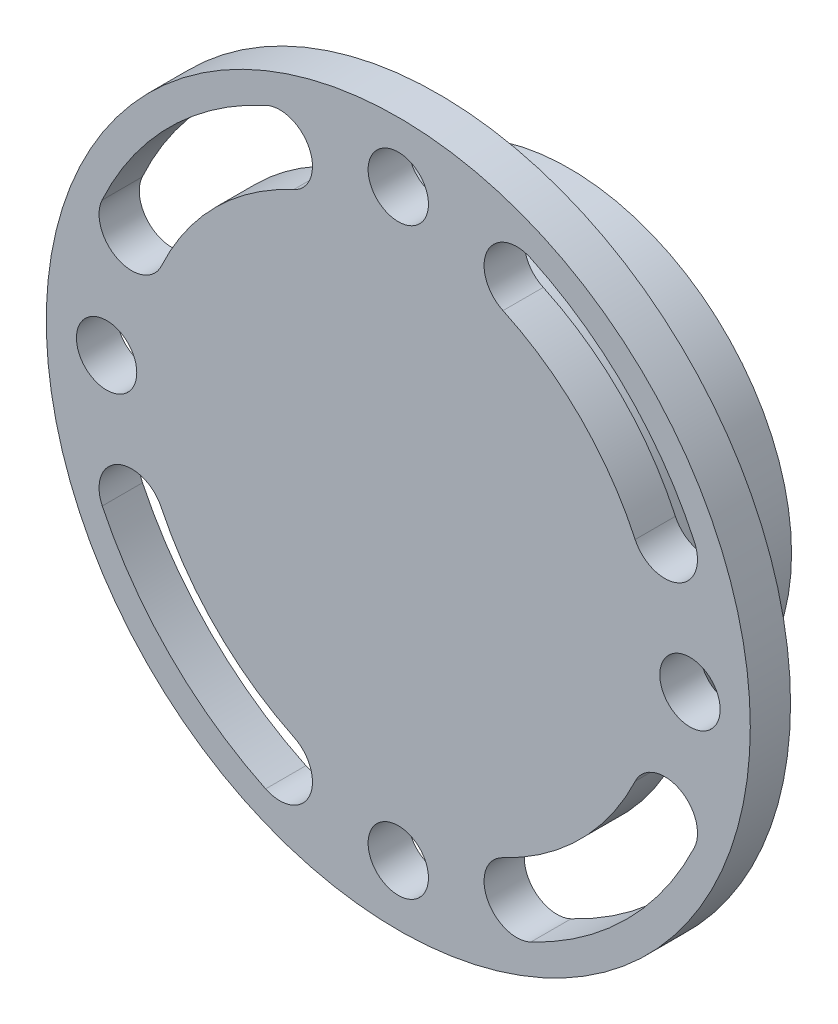
ISO-10303-21;
HEADER;
FILE_DESCRIPTION(('STEP AP214'),'2;1');
FILE_NAME('part.step','',(''),(''),'','','');
FILE_SCHEMA(('AUTOMOTIVE_DESIGN { 1 0 10303 214 1 1 1 1 }'));
ENDSEC;
DATA;
#1=APPLICATION_CONTEXT('core data for automotive mechanical design processes');
#2=APPLICATION_PROTOCOL_DEFINITION('international standard','automotive_design',2000,#1);
#3=PRODUCT_CONTEXT('',#1,'mechanical');
#4=PRODUCT('Part','Part','',(#3));
#5=PRODUCT_RELATED_PRODUCT_CATEGORY('part','',(#4));
#6=PRODUCT_DEFINITION_FORMATION('','',#4);
#7=PRODUCT_DEFINITION_CONTEXT('part definition',#1,'design');
#8=PRODUCT_DEFINITION('design','',#6,#7);
#9=PRODUCT_DEFINITION_SHAPE('','',#8);
#10=(LENGTH_UNIT() NAMED_UNIT(*) SI_UNIT(.MILLI.,.METRE.));
#11=(NAMED_UNIT(*) PLANE_ANGLE_UNIT() SI_UNIT($,.RADIAN.));
#12=(NAMED_UNIT(*) SI_UNIT($,.STERADIAN.) SOLID_ANGLE_UNIT());
#13=UNCERTAINTY_MEASURE_WITH_UNIT(LENGTH_MEASURE(1.E-05),#10,'distance_accuracy_value','');
#14=(GEOMETRIC_REPRESENTATION_CONTEXT(3) GLOBAL_UNCERTAINTY_ASSIGNED_CONTEXT((#13)) GLOBAL_UNIT_ASSIGNED_CONTEXT((#10,
#11,#12)) REPRESENTATION_CONTEXT('',''));
#15=CARTESIAN_POINT('',(0.,0.,0.));
#16=DIRECTION('',(0.,0.,1.));
#17=DIRECTION('',(1.,0.,0.));
#18=AXIS2_PLACEMENT_3D('',#15,#16,#17);
#19=CARTESIAN_POINT('',(0.,0.,-13.));
#20=DIRECTION('',(0.,0.,1.));
#21=DIRECTION('',(1.,0.,0.));
#22=AXIS2_PLACEMENT_3D('',#19,#20,#21);
#23=CYLINDRICAL_SURFACE('',#22,22.1);
#24=CARTESIAN_POINT('',(0.,0.,-13.));
#25=DIRECTION('',(0.,0.,1.));
#26=DIRECTION('',(1.,0.,0.));
#27=AXIS2_PLACEMENT_3D('',#24,#25,#26);
#28=CIRCLE('',#27,22.1);
#29=CARTESIAN_POINT('',(22.1,0.,-13.));
#30=VERTEX_POINT('',#29);
#31=EDGE_CURVE('E12',#30,#30,#28,.T.);
#32=CARTESIAN_POINT('',(0.,0.,0.));
#33=DIRECTION('',(0.,0.,1.));
#34=DIRECTION('',(1.,0.,0.));
#35=AXIS2_PLACEMENT_3D('',#32,#33,#34);
#36=CIRCLE('',#35,22.1);
#37=CARTESIAN_POINT('',(22.1,0.,0.));
#38=VERTEX_POINT('',#37);
#39=EDGE_CURVE('E61',#38,#38,#36,.T.);
#40=CARTESIAN_POINT('',(22.1,0.,-13.));
#41=CARTESIAN_POINT('',(22.1,0.,-12.8645833333333));
#42=CARTESIAN_POINT('',(22.1,0.,-12.7291666666667));
#43=CARTESIAN_POINT('',(22.1,0.,-12.4583333333333));
#44=CARTESIAN_POINT('',(22.1,0.,-12.3229166666667));
#45=CARTESIAN_POINT('',(22.1,0.,-12.0520833333333));
#46=CARTESIAN_POINT('',(22.1,0.,-11.9166666666667));
#47=CARTESIAN_POINT('',(22.1,0.,-11.6458333333333));
#48=CARTESIAN_POINT('',(22.1,0.,-11.5104166666667));
#49=CARTESIAN_POINT('',(22.1,0.,-11.2395833333333));
#50=CARTESIAN_POINT('',(22.1,0.,-11.1041666666667));
#51=CARTESIAN_POINT('',(22.1,0.,-10.8333333333333));
#52=CARTESIAN_POINT('',(22.1,0.,-10.6979166666667));
#53=CARTESIAN_POINT('',(22.1,0.,-10.4270833333333));
#54=CARTESIAN_POINT('',(22.1,0.,-10.2916666666667));
#55=CARTESIAN_POINT('',(22.1,0.,-10.0208333333333));
#56=CARTESIAN_POINT('',(22.1,0.,-9.88541666666667));
#57=CARTESIAN_POINT('',(22.1,0.,-9.61458333333333));
#58=CARTESIAN_POINT('',(22.1,0.,-9.47916666666667));
#59=CARTESIAN_POINT('',(22.1,0.,-9.20833333333333));
#60=CARTESIAN_POINT('',(22.1,0.,-9.07291666666667));
#61=CARTESIAN_POINT('',(22.1,0.,-8.80208333333333));
#62=CARTESIAN_POINT('',(22.1,0.,-8.66666666666667));
#63=CARTESIAN_POINT('',(22.1,0.,-8.39583333333333));
#64=CARTESIAN_POINT('',(22.1,0.,-8.26041666666667));
#65=CARTESIAN_POINT('',(22.1,0.,-7.98958333333333));
#66=CARTESIAN_POINT('',(22.1,0.,-7.85416666666667));
#67=CARTESIAN_POINT('',(22.1,0.,-7.58333333333333));
#68=CARTESIAN_POINT('',(22.1,0.,-7.44791666666667));
#69=CARTESIAN_POINT('',(22.1,0.,-7.17708333333333));
#70=CARTESIAN_POINT('',(22.1,0.,-7.04166666666667));
#71=CARTESIAN_POINT('',(22.1,0.,-6.77083333333333));
#72=CARTESIAN_POINT('',(22.1,0.,-6.63541666666667));
#73=CARTESIAN_POINT('',(22.1,0.,-6.36458333333333));
#74=CARTESIAN_POINT('',(22.1,0.,-6.22916666666667));
#75=CARTESIAN_POINT('',(22.1,0.,-5.95833333333333));
#76=CARTESIAN_POINT('',(22.1,0.,-5.82291666666667));
#77=CARTESIAN_POINT('',(22.1,0.,-5.55208333333333));
#78=CARTESIAN_POINT('',(22.1,0.,-5.41666666666667));
#79=CARTESIAN_POINT('',(22.1,0.,-5.14583333333333));
#80=CARTESIAN_POINT('',(22.1,0.,-5.01041666666667));
#81=CARTESIAN_POINT('',(22.1,0.,-4.73958333333333));
#82=CARTESIAN_POINT('',(22.1,0.,-4.60416666666667));
#83=CARTESIAN_POINT('',(22.1,0.,-4.33333333333333));
#84=CARTESIAN_POINT('',(22.1,0.,-4.19791666666667));
#85=CARTESIAN_POINT('',(22.1,0.,-3.92708333333333));
#86=CARTESIAN_POINT('',(22.1,0.,-3.79166666666667));
#87=CARTESIAN_POINT('',(22.1,0.,-3.52083333333333));
#88=CARTESIAN_POINT('',(22.1,0.,-3.38541666666667));
#89=CARTESIAN_POINT('',(22.1,0.,-3.11458333333333));
#90=CARTESIAN_POINT('',(22.1,0.,-2.97916666666667));
#91=CARTESIAN_POINT('',(22.1,0.,-2.70833333333333));
#92=CARTESIAN_POINT('',(22.1,0.,-2.57291666666667));
#93=CARTESIAN_POINT('',(22.1,0.,-2.30208333333333));
#94=CARTESIAN_POINT('',(22.1,0.,-2.16666666666667));
#95=CARTESIAN_POINT('',(22.1,0.,-1.89583333333333));
#96=CARTESIAN_POINT('',(22.1,0.,-1.76041666666667));
#97=CARTESIAN_POINT('',(22.1,0.,-1.48958333333333));
#98=CARTESIAN_POINT('',(22.1,0.,-1.35416666666667));
#99=CARTESIAN_POINT('',(22.1,0.,-1.08333333333333));
#100=CARTESIAN_POINT('',(22.1,0.,-0.947916666666667));
#101=CARTESIAN_POINT('',(22.1,0.,-0.677083333333334));
#102=CARTESIAN_POINT('',(22.1,0.,-0.541666666666667));
#103=CARTESIAN_POINT('',(22.1,0.,-0.270833333333334));
#104=CARTESIAN_POINT('',(22.1,0.,-0.135416666666667));
#105=CARTESIAN_POINT('',(22.1,0.,0.));
#106=B_SPLINE_CURVE_WITH_KNOTS('',3,(#40,#41,#42,#43,#44,#45,#46,#47,#48,#49,#50,#51,#52,#53,
#54,#55,#56,#57,#58,#59,#60,#61,#62,#63,#64,#65,#66,#67,#68,#69,#70,#71,#72,#73,#74,#75,#76,#77,
#78,#79,#80,#81,#82,#83,#84,#85,#86,#87,#88,#89,#90,#91,#92,#93,#94,#95,#96,#97,#98,#99,#100,
#101,#102,#103,#104,#105),.UNSPECIFIED.,.F.,.F.,(4,2,2,2,2,2,2,2,2,2,2,2,2,2,2,2,2,2,2,2,2,2,2,
2,2,2,2,2,2,2,2,2,4),(0.,0.40625,0.812500000000001,1.21875,1.625,2.03125,2.4375,2.84375,3.25,
3.65625,4.0625,4.46875,4.875,5.28125,5.6875,6.09375,6.5,6.90625,7.3125,7.71875,8.125,8.53125,
8.9375,9.34375,9.75,10.15625,10.5625,10.96875,11.375,11.78125,12.1875,12.59375,13.),.UNSPECIFIED.);
#107=EDGE_CURVE('BSEAM58',#30,#38,#106,.T.);
#108=ORIENTED_EDGE('',*,*,#31,.T.);
#109=ORIENTED_EDGE('',*,*,#39,.F.);
#110=ORIENTED_EDGE('',*,*,#107,.T.);
#111=ORIENTED_EDGE('',*,*,#107,.F.);
#112=EDGE_LOOP('',(#108,#110,#109,#111));
#113=FACE_BOUND('',#112,.T.);
#114=ADVANCED_FACE('F58',(#113),#23,.T.);
#115=CARTESIAN_POINT('',(0.,0.,-13.));
#116=DIRECTION('',(0.,0.,1.));
#117=DIRECTION('',(1.,0.,0.));
#118=AXIS2_PLACEMENT_3D('',#115,#116,#117);
#119=PLANE('',#118);
#120=CARTESIAN_POINT('',(0.,0.,-13.));
#121=DIRECTION('',(0.,0.,1.));
#122=DIRECTION('',(1.,0.,0.));
#123=AXIS2_PLACEMENT_3D('',#120,#121,#122);
#124=CIRCLE('',#123,20.1);
#125=CARTESIAN_POINT('',(20.1,0.,-13.));
#126=VERTEX_POINT('',#125);
#127=EDGE_CURVE('E306',#126,#126,#124,.T.);
#128=ORIENTED_EDGE('',*,*,#127,.T.);
#129=EDGE_LOOP('',(#128));
#130=FACE_BOUND('',#129,.T.);
#131=ORIENTED_EDGE('',*,*,#31,.F.);
#132=EDGE_LOOP('',(#131));
#133=FACE_BOUND('',#132,.T.);
#134=ADVANCED_FACE('F333',(#130,#133),#119,.F.);
#135=CARTESIAN_POINT('',(0.,0.,-13.));
#136=DIRECTION('',(0.,0.,1.));
#137=DIRECTION('',(1.,0.,0.));
#138=AXIS2_PLACEMENT_3D('',#135,#136,#137);
#139=CYLINDRICAL_SURFACE('',#138,20.1);
#140=CARTESIAN_POINT('',(0.,0.,0.));
#141=DIRECTION('',(0.,0.,1.));
#142=DIRECTION('',(1.,0.,0.));
#143=AXIS2_PLACEMENT_3D('',#140,#141,#142);
#144=CIRCLE('',#143,20.1);
#145=CARTESIAN_POINT('',(20.1,0.,0.));
#146=VERTEX_POINT('',#145);
#147=EDGE_CURVE('E303',#146,#146,#144,.T.);
#148=CARTESIAN_POINT('',(20.1,0.,-13.));
#149=CARTESIAN_POINT('',(20.1,0.,-12.8645833333333));
#150=CARTESIAN_POINT('',(20.1,0.,-12.7291666666667));
#151=CARTESIAN_POINT('',(20.1,0.,-12.4583333333333));
#152=CARTESIAN_POINT('',(20.1,0.,-12.3229166666667));
#153=CARTESIAN_POINT('',(20.1,0.,-12.0520833333333));
#154=CARTESIAN_POINT('',(20.1,0.,-11.9166666666667));
#155=CARTESIAN_POINT('',(20.1,0.,-11.6458333333333));
#156=CARTESIAN_POINT('',(20.1,0.,-11.5104166666667));
#157=CARTESIAN_POINT('',(20.1,0.,-11.2395833333333));
#158=CARTESIAN_POINT('',(20.1,0.,-11.1041666666667));
#159=CARTESIAN_POINT('',(20.1,0.,-10.8333333333333));
#160=CARTESIAN_POINT('',(20.1,0.,-10.6979166666667));
#161=CARTESIAN_POINT('',(20.1,0.,-10.4270833333333));
#162=CARTESIAN_POINT('',(20.1,0.,-10.2916666666667));
#163=CARTESIAN_POINT('',(20.1,0.,-10.0208333333333));
#164=CARTESIAN_POINT('',(20.1,0.,-9.88541666666667));
#165=CARTESIAN_POINT('',(20.1,0.,-9.61458333333333));
#166=CARTESIAN_POINT('',(20.1,0.,-9.47916666666667));
#167=CARTESIAN_POINT('',(20.1,0.,-9.20833333333333));
#168=CARTESIAN_POINT('',(20.1,0.,-9.07291666666667));
#169=CARTESIAN_POINT('',(20.1,0.,-8.80208333333333));
#170=CARTESIAN_POINT('',(20.1,0.,-8.66666666666667));
#171=CARTESIAN_POINT('',(20.1,0.,-8.39583333333333));
#172=CARTESIAN_POINT('',(20.1,0.,-8.26041666666667));
#173=CARTESIAN_POINT('',(20.1,0.,-7.98958333333333));
#174=CARTESIAN_POINT('',(20.1,0.,-7.85416666666667));
#175=CARTESIAN_POINT('',(20.1,0.,-7.58333333333333));
#176=CARTESIAN_POINT('',(20.1,0.,-7.44791666666667));
#177=CARTESIAN_POINT('',(20.1,0.,-7.17708333333333));
#178=CARTESIAN_POINT('',(20.1,0.,-7.04166666666667));
#179=CARTESIAN_POINT('',(20.1,0.,-6.77083333333333));
#180=CARTESIAN_POINT('',(20.1,0.,-6.63541666666667));
#181=CARTESIAN_POINT('',(20.1,0.,-6.36458333333333));
#182=CARTESIAN_POINT('',(20.1,0.,-6.22916666666667));
#183=CARTESIAN_POINT('',(20.1,0.,-5.95833333333333));
#184=CARTESIAN_POINT('',(20.1,0.,-5.82291666666667));
#185=CARTESIAN_POINT('',(20.1,0.,-5.55208333333333));
#186=CARTESIAN_POINT('',(20.1,0.,-5.41666666666667));
#187=CARTESIAN_POINT('',(20.1,0.,-5.14583333333333));
#188=CARTESIAN_POINT('',(20.1,0.,-5.01041666666667));
#189=CARTESIAN_POINT('',(20.1,0.,-4.73958333333333));
#190=CARTESIAN_POINT('',(20.1,0.,-4.60416666666667));
#191=CARTESIAN_POINT('',(20.1,0.,-4.33333333333333));
#192=CARTESIAN_POINT('',(20.1,0.,-4.19791666666667));
#193=CARTESIAN_POINT('',(20.1,0.,-3.92708333333333));
#194=CARTESIAN_POINT('',(20.1,0.,-3.79166666666667));
#195=CARTESIAN_POINT('',(20.1,0.,-3.52083333333333));
#196=CARTESIAN_POINT('',(20.1,0.,-3.38541666666667));
#197=CARTESIAN_POINT('',(20.1,0.,-3.11458333333333));
#198=CARTESIAN_POINT('',(20.1,0.,-2.97916666666667));
#199=CARTESIAN_POINT('',(20.1,0.,-2.70833333333333));
#200=CARTESIAN_POINT('',(20.1,0.,-2.57291666666667));
#201=CARTESIAN_POINT('',(20.1,0.,-2.30208333333333));
#202=CARTESIAN_POINT('',(20.1,0.,-2.16666666666667));
#203=CARTESIAN_POINT('',(20.1,0.,-1.89583333333333));
#204=CARTESIAN_POINT('',(20.1,0.,-1.76041666666667));
#205=CARTESIAN_POINT('',(20.1,0.,-1.48958333333333));
#206=CARTESIAN_POINT('',(20.1,0.,-1.35416666666667));
#207=CARTESIAN_POINT('',(20.1,0.,-1.08333333333333));
#208=CARTESIAN_POINT('',(20.1,0.,-0.947916666666667));
#209=CARTESIAN_POINT('',(20.1,0.,-0.677083333333334));
#210=CARTESIAN_POINT('',(20.1,0.,-0.541666666666667));
#211=CARTESIAN_POINT('',(20.1,0.,-0.270833333333334));
#212=CARTESIAN_POINT('',(20.1,0.,-0.135416666666667));
#213=CARTESIAN_POINT('',(20.1,0.,0.));
#214=B_SPLINE_CURVE_WITH_KNOTS('',3,(#148,#149,#150,#151,#152,#153,#154,#155,#156,#157,#158,
#159,#160,#161,#162,#163,#164,#165,#166,#167,#168,#169,#170,#171,#172,#173,#174,#175,#176,#177,
#178,#179,#180,#181,#182,#183,#184,#185,#186,#187,#188,#189,#190,#191,#192,#193,#194,#195,#196,
#197,#198,#199,#200,#201,#202,#203,#204,#205,#206,#207,#208,#209,#210,#211,#212,#213),
.UNSPECIFIED.,.F.,.F.,(4,2,2,2,2,2,2,2,2,2,2,2,2,2,2,2,2,2,2,2,2,2,2,2,2,2,2,2,2,2,2,2,4),(0.,
0.40625,0.812500000000001,1.21875,1.625,2.03125,2.4375,2.84375,3.25,3.65625,4.0625,4.46875,
4.875,5.28125,5.6875,6.09375,6.5,6.90625,7.3125,7.71875,8.125,8.53125,8.9375,9.34375,9.75,
10.15625,10.5625,10.96875,11.375,11.78125,12.1875,12.59375,13.),.UNSPECIFIED.);
#215=EDGE_CURVE('BSEAM312',#126,#146,#214,.T.);
#216=ORIENTED_EDGE('',*,*,#127,.F.);
#217=ORIENTED_EDGE('',*,*,#147,.T.);
#218=ORIENTED_EDGE('',*,*,#215,.T.);
#219=ORIENTED_EDGE('',*,*,#215,.F.);
#220=EDGE_LOOP('',(#216,#218,#217,#219));
#221=FACE_BOUND('',#220,.T.);
#222=ADVANCED_FACE('F312',(#221),#139,.F.);
#223=CARTESIAN_POINT('',(0.,0.,0.));
#224=DIRECTION('',(0.,0.,1.));
#225=DIRECTION('',(1.,0.,0.));
#226=AXIS2_PLACEMENT_3D('',#223,#224,#225);
#227=PLANE('',#226);
#228=CARTESIAN_POINT('',(0.,29.,0.));
#229=DIRECTION('',(0.,0.,1.));
#230=DIRECTION('',(1.,0.,0.));
#231=AXIS2_PLACEMENT_3D('',#228,#229,#230);
#232=CIRCLE('',#231,3.);
#233=CARTESIAN_POINT('',(3.,29.,0.));
#234=VERTEX_POINT('',#233);
#235=EDGE_CURVE('E576',#234,#234,#232,.T.);
#236=ORIENTED_EDGE('',*,*,#235,.T.);
#237=EDGE_LOOP('',(#236));
#238=FACE_BOUND('',#237,.T.);
#239=CARTESIAN_POINT('',(-29.,0.,0.));
#240=DIRECTION('',(0.,0.,1.));
#241=DIRECTION('',(1.,0.,0.));
#242=AXIS2_PLACEMENT_3D('',#239,#240,#241);
#243=CIRCLE('',#242,3.);
#244=CARTESIAN_POINT('',(-26.,0.,0.));
#245=VERTEX_POINT('',#244);
#246=EDGE_CURVE('E581',#245,#245,#243,.T.);
#247=ORIENTED_EDGE('',*,*,#246,.T.);
#248=EDGE_LOOP('',(#247));
#249=FACE_BOUND('',#248,.T.);
#250=CARTESIAN_POINT('',(0.,-29.,0.));
#251=DIRECTION('',(0.,0.,1.));
#252=DIRECTION('',(1.,0.,0.));
#253=AXIS2_PLACEMENT_3D('',#250,#251,#252);
#254=CIRCLE('',#253,3.);
#255=CARTESIAN_POINT('',(3.,-29.,0.));
#256=VERTEX_POINT('',#255);
#257=EDGE_CURVE('E589',#256,#256,#254,.T.);
#258=ORIENTED_EDGE('',*,*,#257,.T.);
#259=EDGE_LOOP('',(#258));
#260=FACE_BOUND('',#259,.T.);
#261=CARTESIAN_POINT('',(29.,0.,0.));
#262=DIRECTION('',(0.,0.,1.));
#263=DIRECTION('',(1.,0.,0.));
#264=AXIS2_PLACEMENT_3D('',#261,#262,#263);
#265=CIRCLE('',#264,3.);
#266=CARTESIAN_POINT('',(32.,0.,0.));
#267=VERTEX_POINT('',#266);
#268=EDGE_CURVE('E595',#267,#267,#265,.T.);
#269=ORIENTED_EDGE('',*,*,#268,.T.);
#270=EDGE_LOOP('',(#269));
#271=FACE_BOUND('',#270,.T.);
#272=CARTESIAN_POINT('',(-26.5,11.7792189893897,0.));
#273=DIRECTION('',(0.,0.,1.));
#274=DIRECTION('',(1.,0.,0.));
#275=AXIS2_PLACEMENT_3D('',#272,#273,#274);
#276=CIRCLE('',#275,3.25);
#277=CARTESIAN_POINT('',(-29.4546724073097,13.1328847404092,0.));
#278=VERTEX_POINT('',#277);
#279=CARTESIAN_POINT('',(-23.5453275926904,10.4255532383703,0.));
#280=VERTEX_POINT('',#279);
#281=EDGE_CURVE('E256',#278,#280,#276,.T.);
#282=ORIENTED_EDGE('',*,*,#281,.T.);
#283=CARTESIAN_POINT('',(0.667335810384379,-0.667335810384379,0.));
#284=DIRECTION('',(0.,0.,1.));
#285=DIRECTION('',(1.,0.,0.));
#286=AXIS2_PLACEMENT_3D('',#283,#284,#285);
#287=CIRCLE('',#286,26.6327853691381);
#288=CARTESIAN_POINT('',(-10.4255532383703,23.5453275926904,0.));
#289=VERTEX_POINT('',#288);
#290=EDGE_CURVE('E252',#289,#280,#287,.T.);
#291=ORIENTED_EDGE('',*,*,#290,.F.);
#292=CARTESIAN_POINT('',(-11.7792189893897,26.5,0.));
#293=DIRECTION('',(0.,0.,1.));
#294=DIRECTION('',(1.,0.,0.));
#295=AXIS2_PLACEMENT_3D('',#292,#293,#294);
#296=CIRCLE('',#295,3.25);
#297=CARTESIAN_POINT('',(-13.1328847404091,29.4546724073097,0.));
#298=VERTEX_POINT('',#297);
#299=EDGE_CURVE('E72',#289,#298,#296,.T.);
#300=ORIENTED_EDGE('',*,*,#299,.T.);
#301=CARTESIAN_POINT('',(0.667335810384379,-0.667335810384379,0.));
#302=DIRECTION('',(0.,0.,1.));
#303=DIRECTION('',(1.,0.,0.));
#304=AXIS2_PLACEMENT_3D('',#301,#302,#303);
#305=CIRCLE('',#304,33.1327853691381);
#306=EDGE_CURVE('E214',#298,#278,#305,.T.);
#307=ORIENTED_EDGE('',*,*,#306,.T.);
#308=EDGE_LOOP('',(#282,#291,#300,#307));
#309=FACE_BOUND('',#308,.T.);
#310=CARTESIAN_POINT('',(-0.944302609544662,-0.944302609544662,0.));
#311=DIRECTION('',(0.,0.,1.));
#312=DIRECTION('',(1.,0.,0.));
#313=AXIS2_PLACEMENT_3D('',#310,#311,#312);
#314=CIRCLE('',#313,33.5002520254429);
#315=CARTESIAN_POINT('',(29.4485368718913,13.1461975243705,0.));
#316=VERTEX_POINT('',#315);
#317=CARTESIAN_POINT('',(13.1461975243704,29.4485368718912,0.));
#318=VERTEX_POINT('',#317);
#319=EDGE_CURVE('E80',#316,#318,#314,.T.);
#320=ORIENTED_EDGE('',*,*,#319,.T.);
#321=CARTESIAN_POINT('',(11.7792189893897,26.5,0.));
#322=DIRECTION('',(0.,0.,1.));
#323=DIRECTION('',(1.,0.,0.));
#324=AXIS2_PLACEMENT_3D('',#321,#322,#323);
#325=CIRCLE('',#324,3.25);
#326=CARTESIAN_POINT('',(10.412240454409,23.5514631281088,0.));
#327=VERTEX_POINT('',#326);
#328=EDGE_CURVE('E228',#318,#327,#325,.T.);
#329=ORIENTED_EDGE('',*,*,#328,.T.);
#330=CARTESIAN_POINT('',(-0.944302609544662,-0.944302609544662,0.));
#331=DIRECTION('',(0.,0.,1.));
#332=DIRECTION('',(1.,0.,0.));
#333=AXIS2_PLACEMENT_3D('',#330,#331,#332);
#334=CIRCLE('',#333,27.0002520254429);
#335=CARTESIAN_POINT('',(23.5514631281088,10.4122404544091,0.));
#336=VERTEX_POINT('',#335);
#337=EDGE_CURVE('E224',#336,#327,#334,.T.);
#338=ORIENTED_EDGE('',*,*,#337,.F.);
#339=CARTESIAN_POINT('',(26.5000000000001,11.7792189893898,0.));
#340=DIRECTION('',(0.,0.,1.));
#341=DIRECTION('',(1.,0.,0.));
#342=AXIS2_PLACEMENT_3D('',#339,#340,#341);
#343=CIRCLE('',#342,3.25);
#344=EDGE_CURVE('E221',#336,#316,#343,.T.);
#345=ORIENTED_EDGE('',*,*,#344,.T.);
#346=EDGE_LOOP('',(#320,#329,#338,#345));
#347=FACE_BOUND('',#346,.T.);
#348=CARTESIAN_POINT('',(-1.55949985491384,1.55949985491384,0.));
#349=DIRECTION('',(0.,0.,1.));
#350=DIRECTION('',(1.,0.,0.));
#351=AXIS2_PLACEMENT_3D('',#348,#349,#350);
#352=CIRCLE('',#351,34.3185846558109);
#353=CARTESIAN_POINT('',(13.1745460287204,-29.4352278366956,0.));
#354=VERTEX_POINT('',#353);
#355=CARTESIAN_POINT('',(29.4352278366956,-13.1745460287204,0.));
#356=VERTEX_POINT('',#355);
#357=EDGE_CURVE('E199',#354,#356,#352,.T.);
#358=ORIENTED_EDGE('',*,*,#357,.T.);
#359=CARTESIAN_POINT('',(26.5,-11.7792189893898,0.));
#360=DIRECTION('',(0.,0.,1.));
#361=DIRECTION('',(1.,0.,0.));
#362=AXIS2_PLACEMENT_3D('',#359,#360,#361);
#363=CIRCLE('',#362,3.25);
#364=CARTESIAN_POINT('',(23.5647721633044,-10.3838919500591,0.));
#365=VERTEX_POINT('',#364);
#366=EDGE_CURVE('E197',#356,#365,#363,.T.);
#367=ORIENTED_EDGE('',*,*,#366,.T.);
#368=CARTESIAN_POINT('',(-1.55949985491384,1.55949985491384,0.));
#369=DIRECTION('',(0.,0.,1.));
#370=DIRECTION('',(1.,0.,0.));
#371=AXIS2_PLACEMENT_3D('',#368,#369,#370);
#372=CIRCLE('',#371,27.8185846558109);
#373=CARTESIAN_POINT('',(10.3838919500591,-23.5647721633044,0.));
#374=VERTEX_POINT('',#373);
#375=EDGE_CURVE('E177',#374,#365,#372,.T.);
#376=ORIENTED_EDGE('',*,*,#375,.F.);
#377=CARTESIAN_POINT('',(11.7792189893898,-26.5,0.));
#378=DIRECTION('',(0.,0.,1.));
#379=DIRECTION('',(1.,0.,0.));
#380=AXIS2_PLACEMENT_3D('',#377,#378,#379);
#381=CIRCLE('',#380,3.25000000000001);
#382=EDGE_CURVE('E188',#374,#354,#381,.T.);
#383=ORIENTED_EDGE('',*,*,#382,.T.);
#384=EDGE_LOOP('',(#358,#367,#376,#383));
#385=FACE_BOUND('',#384,.T.);
#386=CARTESIAN_POINT('',(1.87191199143339,1.87191199143339,0.));
#387=DIRECTION('',(0.,0.,1.));
#388=DIRECTION('',(1.,0.,0.));
#389=AXIS2_PLACEMENT_3D('',#386,#387,#388);
#390=CIRCLE('',#389,34.7352150557247);
#391=CARTESIAN_POINT('',(-29.4286353550059,-13.1883303964153,0.));
#392=VERTEX_POINT('',#391);
#393=CARTESIAN_POINT('',(-13.1883303964153,-29.4286353550059,0.));
#394=VERTEX_POINT('',#393);
#395=EDGE_CURVE('E204',#392,#394,#390,.T.);
#396=ORIENTED_EDGE('',*,*,#395,.T.);
#397=CARTESIAN_POINT('',(-11.7792189893898,-26.5,0.));
#398=DIRECTION('',(0.,0.,1.));
#399=DIRECTION('',(1.,0.,0.));
#400=AXIS2_PLACEMENT_3D('',#397,#398,#399);
#401=CIRCLE('',#400,3.25);
#402=CARTESIAN_POINT('',(-10.3701075823642,-23.5713646449941,0.));
#403=VERTEX_POINT('',#402);
#404=EDGE_CURVE('E282',#394,#403,#401,.T.);
#405=ORIENTED_EDGE('',*,*,#404,.T.);
#406=CARTESIAN_POINT('',(1.87191199143339,1.87191199143339,0.));
#407=DIRECTION('',(0.,0.,1.));
#408=DIRECTION('',(1.,0.,0.));
#409=AXIS2_PLACEMENT_3D('',#406,#407,#408);
#410=CIRCLE('',#409,28.2352150557247);
#411=CARTESIAN_POINT('',(-23.5713646449941,-10.3701075823642,0.));
#412=VERTEX_POINT('',#411);
#413=EDGE_CURVE('E285',#412,#403,#410,.T.);
#414=ORIENTED_EDGE('',*,*,#413,.F.);
#415=CARTESIAN_POINT('',(-26.5,-11.7792189893898,0.));
#416=DIRECTION('',(0.,0.,1.));
#417=DIRECTION('',(1.,0.,0.));
#418=AXIS2_PLACEMENT_3D('',#415,#416,#417);
#419=CIRCLE('',#418,3.25);
#420=EDGE_CURVE('E272',#412,#392,#419,.T.);
#421=ORIENTED_EDGE('',*,*,#420,.T.);
#422=EDGE_LOOP('',(#396,#405,#414,#421));
#423=FACE_BOUND('',#422,.T.);
#424=ORIENTED_EDGE('',*,*,#39,.T.);
#425=EDGE_LOOP('',(#424));
#426=FACE_BOUND('',#425,.T.);
#427=CARTESIAN_POINT('',(0.,0.,0.));
#428=DIRECTION('',(0.,0.,1.));
#429=DIRECTION('',(1.,0.,0.));
#430=AXIS2_PLACEMENT_3D('',#427,#428,#429);
#431=CIRCLE('',#430,35.);
#432=CARTESIAN_POINT('',(35.,0.,0.));
#433=VERTEX_POINT('',#432);
#434=EDGE_CURVE('E299',#433,#433,#431,.T.);
#435=ORIENTED_EDGE('',*,*,#434,.F.);
#436=EDGE_LOOP('',(#435));
#437=FACE_BOUND('',#436,.T.);
#438=ADVANCED_FACE('F195',(#238,#249,#260,#271,#309,#347,#385,#423,#426,#437),#227,.F.);
#439=CARTESIAN_POINT('',(0.,0.,4.));
#440=DIRECTION('',(0.,0.,1.));
#441=DIRECTION('',(1.,0.,0.));
#442=AXIS2_PLACEMENT_3D('',#439,#440,#441);
#443=PLANE('',#442);
#444=CARTESIAN_POINT('',(0.,29.,4.));
#445=DIRECTION('',(0.,0.,1.));
#446=DIRECTION('',(1.,0.,0.));
#447=AXIS2_PLACEMENT_3D('',#444,#445,#446);
#448=CIRCLE('',#447,3.);
#449=CARTESIAN_POINT('',(3.,29.,4.));
#450=VERTEX_POINT('',#449);
#451=EDGE_CURVE('E244',#450,#450,#448,.T.);
#452=ORIENTED_EDGE('',*,*,#451,.F.);
#453=EDGE_LOOP('',(#452));
#454=FACE_BOUND('',#453,.T.);
#455=CARTESIAN_POINT('',(-29.,0.,4.));
#456=DIRECTION('',(0.,0.,1.));
#457=DIRECTION('',(1.,0.,0.));
#458=AXIS2_PLACEMENT_3D('',#455,#456,#457);
#459=CIRCLE('',#458,3.);
#460=CARTESIAN_POINT('',(-26.,0.,4.));
#461=VERTEX_POINT('',#460);
#462=EDGE_CURVE('E577',#461,#461,#459,.T.);
#463=ORIENTED_EDGE('',*,*,#462,.F.);
#464=EDGE_LOOP('',(#463));
#465=FACE_BOUND('',#464,.T.);
#466=CARTESIAN_POINT('',(0.,-29.,4.));
#467=DIRECTION('',(0.,0.,1.));
#468=DIRECTION('',(1.,0.,0.));
#469=AXIS2_PLACEMENT_3D('',#466,#467,#468);
#470=CIRCLE('',#469,3.);
#471=CARTESIAN_POINT('',(3.,-29.,4.));
#472=VERTEX_POINT('',#471);
#473=EDGE_CURVE('E586',#472,#472,#470,.T.);
#474=ORIENTED_EDGE('',*,*,#473,.F.);
#475=EDGE_LOOP('',(#474));
#476=FACE_BOUND('',#475,.T.);
#477=CARTESIAN_POINT('',(29.,0.,4.));
#478=DIRECTION('',(0.,0.,1.));
#479=DIRECTION('',(1.,0.,0.));
#480=AXIS2_PLACEMENT_3D('',#477,#478,#479);
#481=CIRCLE('',#480,3.);
#482=CARTESIAN_POINT('',(32.,0.,4.));
#483=VERTEX_POINT('',#482);
#484=EDGE_CURVE('E592',#483,#483,#481,.T.);
#485=ORIENTED_EDGE('',*,*,#484,.F.);
#486=EDGE_LOOP('',(#485));
#487=FACE_BOUND('',#486,.T.);
#488=CARTESIAN_POINT('',(0.667335810384379,-0.667335810384379,4.));
#489=DIRECTION('',(0.,0.,1.));
#490=DIRECTION('',(1.,0.,0.));
#491=AXIS2_PLACEMENT_3D('',#488,#489,#490);
#492=CIRCLE('',#491,26.6327853691381);
#493=CARTESIAN_POINT('',(-10.4255532383703,23.5453275926904,4.));
#494=VERTEX_POINT('',#493);
#495=CARTESIAN_POINT('',(-23.5453275926904,10.4255532383703,4.));
#496=VERTEX_POINT('',#495);
#497=EDGE_CURVE('E262',#494,#496,#492,.T.);
#498=ORIENTED_EDGE('',*,*,#497,.T.);
#499=CARTESIAN_POINT('',(-26.5,11.7792189893897,4.));
#500=DIRECTION('',(0.,0.,1.));
#501=DIRECTION('',(1.,0.,0.));
#502=AXIS2_PLACEMENT_3D('',#499,#500,#501);
#503=CIRCLE('',#502,3.25);
#504=CARTESIAN_POINT('',(-29.4546724073097,13.1328847404092,4.));
#505=VERTEX_POINT('',#504);
#506=EDGE_CURVE('E265',#505,#496,#503,.T.);
#507=ORIENTED_EDGE('',*,*,#506,.F.);
#508=CARTESIAN_POINT('',(0.667335810384379,-0.667335810384379,4.));
#509=DIRECTION('',(0.,0.,1.));
#510=DIRECTION('',(1.,0.,0.));
#511=AXIS2_PLACEMENT_3D('',#508,#509,#510);
#512=CIRCLE('',#511,33.1327853691381);
#513=CARTESIAN_POINT('',(-13.1328847404091,29.4546724073097,4.));
#514=VERTEX_POINT('',#513);
#515=EDGE_CURVE('E253',#514,#505,#512,.T.);
#516=ORIENTED_EDGE('',*,*,#515,.F.);
#517=CARTESIAN_POINT('',(-11.7792189893897,26.5,4.));
#518=DIRECTION('',(0.,0.,1.));
#519=DIRECTION('',(1.,0.,0.));
#520=AXIS2_PLACEMENT_3D('',#517,#518,#519);
#521=CIRCLE('',#520,3.25);
#522=EDGE_CURVE('E250',#494,#514,#521,.T.);
#523=ORIENTED_EDGE('',*,*,#522,.F.);
#524=EDGE_LOOP('',(#498,#507,#516,#523));
#525=FACE_BOUND('',#524,.T.);
#526=CARTESIAN_POINT('',(11.7792189893897,26.5,4.));
#527=DIRECTION('',(0.,0.,1.));
#528=DIRECTION('',(1.,0.,0.));
#529=AXIS2_PLACEMENT_3D('',#526,#527,#528);
#530=CIRCLE('',#529,3.25);
#531=CARTESIAN_POINT('',(13.1461975243704,29.4485368718912,4.));
#532=VERTEX_POINT('',#531);
#533=CARTESIAN_POINT('',(10.412240454409,23.5514631281088,4.));
#534=VERTEX_POINT('',#533);
#535=EDGE_CURVE('E237',#532,#534,#530,.T.);
#536=ORIENTED_EDGE('',*,*,#535,.F.);
#537=CARTESIAN_POINT('',(-0.944302609544662,-0.944302609544662,4.));
#538=DIRECTION('',(0.,0.,1.));
#539=DIRECTION('',(1.,0.,0.));
#540=AXIS2_PLACEMENT_3D('',#537,#538,#539);
#541=CIRCLE('',#540,33.5002520254429);
#542=CARTESIAN_POINT('',(29.4485368718912,13.1461975243705,4.));
#543=VERTEX_POINT('',#542);
#544=EDGE_CURVE('E225',#543,#532,#541,.T.);
#545=ORIENTED_EDGE('',*,*,#544,.F.);
#546=CARTESIAN_POINT('',(26.5000000000001,11.7792189893898,4.));
#547=DIRECTION('',(0.,0.,1.));
#548=DIRECTION('',(1.,0.,0.));
#549=AXIS2_PLACEMENT_3D('',#546,#547,#548);
#550=CIRCLE('',#549,3.25);
#551=CARTESIAN_POINT('',(23.5514631281089,10.4122404544091,4.));
#552=VERTEX_POINT('',#551);
#553=EDGE_CURVE('E220',#552,#543,#550,.T.);
#554=ORIENTED_EDGE('',*,*,#553,.F.);
#555=CARTESIAN_POINT('',(-0.944302609544662,-0.944302609544662,4.));
#556=DIRECTION('',(0.,0.,1.));
#557=DIRECTION('',(1.,0.,0.));
#558=AXIS2_PLACEMENT_3D('',#555,#556,#557);
#559=CIRCLE('',#558,27.0002520254429);
#560=EDGE_CURVE('E234',#552,#534,#559,.T.);
#561=ORIENTED_EDGE('',*,*,#560,.T.);
#562=EDGE_LOOP('',(#536,#545,#554,#561));
#563=FACE_BOUND('',#562,.T.);
#564=CARTESIAN_POINT('',(26.5,-11.7792189893898,4.));
#565=DIRECTION('',(0.,0.,1.));
#566=DIRECTION('',(1.,0.,0.));
#567=AXIS2_PLACEMENT_3D('',#564,#565,#566);
#568=CIRCLE('',#567,3.25);
#569=CARTESIAN_POINT('',(29.4352278366956,-13.1745460287204,4.));
#570=VERTEX_POINT('',#569);
#571=CARTESIAN_POINT('',(23.5647721633044,-10.3838919500591,4.));
#572=VERTEX_POINT('',#571);
#573=EDGE_CURVE('E208',#570,#572,#568,.T.);
#574=ORIENTED_EDGE('',*,*,#573,.F.);
#575=CARTESIAN_POINT('',(-1.55949985491384,1.55949985491384,4.));
#576=DIRECTION('',(0.,0.,1.));
#577=DIRECTION('',(1.,0.,0.));
#578=AXIS2_PLACEMENT_3D('',#575,#576,#577);
#579=CIRCLE('',#578,34.3185846558109);
#580=CARTESIAN_POINT('',(13.1745460287204,-29.4352278366956,4.));
#581=VERTEX_POINT('',#580);
#582=EDGE_CURVE('E193',#581,#570,#579,.T.);
#583=ORIENTED_EDGE('',*,*,#582,.F.);
#584=CARTESIAN_POINT('',(11.7792189893898,-26.5,4.));
#585=DIRECTION('',(0.,0.,1.));
#586=DIRECTION('',(1.,0.,0.));
#587=AXIS2_PLACEMENT_3D('',#584,#585,#586);
#588=CIRCLE('',#587,3.25000000000001);
#589=CARTESIAN_POINT('',(10.3838919500591,-23.5647721633044,4.));
#590=VERTEX_POINT('',#589);
#591=EDGE_CURVE('E205',#590,#581,#588,.T.);
#592=ORIENTED_EDGE('',*,*,#591,.F.);
#593=CARTESIAN_POINT('',(-1.55949985491384,1.55949985491384,4.));
#594=DIRECTION('',(0.,0.,1.));
#595=DIRECTION('',(1.,0.,0.));
#596=AXIS2_PLACEMENT_3D('',#593,#594,#595);
#597=CIRCLE('',#596,27.8185846558109);
#598=EDGE_CURVE('E180',#590,#572,#597,.T.);
#599=ORIENTED_EDGE('',*,*,#598,.T.);
#600=EDGE_LOOP('',(#574,#583,#592,#599));
#601=FACE_BOUND('',#600,.T.);
#602=CARTESIAN_POINT('',(-11.7792189893898,-26.5,4.));
#603=DIRECTION('',(0.,0.,1.));
#604=DIRECTION('',(1.,0.,0.));
#605=AXIS2_PLACEMENT_3D('',#602,#603,#604);
#606=CIRCLE('',#605,3.25);
#607=CARTESIAN_POINT('',(-13.1883303964153,-29.4286353550059,4.));
#608=VERTEX_POINT('',#607);
#609=CARTESIAN_POINT('',(-10.3701075823642,-23.5713646449941,4.));
#610=VERTEX_POINT('',#609);
#611=EDGE_CURVE('E271',#608,#610,#606,.T.);
#612=ORIENTED_EDGE('',*,*,#611,.F.);
#613=CARTESIAN_POINT('',(1.87191199143339,1.87191199143339,4.));
#614=DIRECTION('',(0.,0.,1.));
#615=DIRECTION('',(1.,0.,0.));
#616=AXIS2_PLACEMENT_3D('',#613,#614,#615);
#617=CIRCLE('',#616,34.7352150557247);
#618=CARTESIAN_POINT('',(-29.4286353550059,-13.1883303964153,4.));
#619=VERTEX_POINT('',#618);
#620=EDGE_CURVE('E269',#619,#608,#617,.T.);
#621=ORIENTED_EDGE('',*,*,#620,.F.);
#622=CARTESIAN_POINT('',(-26.5,-11.7792189893898,4.));
#623=DIRECTION('',(0.,0.,1.));
#624=DIRECTION('',(1.,0.,0.));
#625=AXIS2_PLACEMENT_3D('',#622,#623,#624);
#626=CIRCLE('',#625,3.25);
#627=CARTESIAN_POINT('',(-23.5713646449941,-10.3701075823642,4.));
#628=VERTEX_POINT('',#627);
#629=EDGE_CURVE('E277',#628,#619,#626,.T.);
#630=ORIENTED_EDGE('',*,*,#629,.F.);
#631=CARTESIAN_POINT('',(1.87191199143339,1.87191199143339,4.));
#632=DIRECTION('',(0.,0.,1.));
#633=DIRECTION('',(1.,0.,0.));
#634=AXIS2_PLACEMENT_3D('',#631,#632,#633);
#635=CIRCLE('',#634,28.2352150557247);
#636=EDGE_CURVE('E274',#628,#610,#635,.T.);
#637=ORIENTED_EDGE('',*,*,#636,.T.);
#638=EDGE_LOOP('',(#612,#621,#630,#637));
#639=FACE_BOUND('',#638,.T.);
#640=CARTESIAN_POINT('',(0.,0.,4.));
#641=DIRECTION('',(0.,0.,1.));
#642=DIRECTION('',(1.,0.,0.));
#643=AXIS2_PLACEMENT_3D('',#640,#641,#642);
#644=CIRCLE('',#643,35.);
#645=CARTESIAN_POINT('',(35.,0.,4.));
#646=VERTEX_POINT('',#645);
#647=EDGE_CURVE('E300',#646,#646,#644,.T.);
#648=ORIENTED_EDGE('',*,*,#647,.T.);
#649=EDGE_LOOP('',(#648));
#650=FACE_BOUND('',#649,.T.);
#651=ADVANCED_FACE('F326',(#454,#465,#476,#487,#525,#563,#601,#639,#650),#443,.T.);
#652=CARTESIAN_POINT('',(0.,0.,4.));
#653=DIRECTION('',(0.,0.,-1.));
#654=DIRECTION('',(-1.,0.,0.));
#655=AXIS2_PLACEMENT_3D('',#652,#653,#654);
#656=CYLINDRICAL_SURFACE('',#655,35.);
#657=ORIENTED_EDGE('',*,*,#647,.F.);
#658=EDGE_LOOP('',(#657));
#659=FACE_BOUND('',#658,.T.);
#660=ORIENTED_EDGE('',*,*,#434,.T.);
#661=EDGE_LOOP('',(#660));
#662=FACE_BOUND('',#661,.T.);
#663=ADVANCED_FACE('F317',(#659,#662),#656,.T.);
#664=ORIENTED_EDGE('',*,*,#147,.F.);
#665=EDGE_LOOP('',(#664));
#666=FACE_BOUND('',#665,.T.);
#667=ADVANCED_FACE('F314',(#666),#227,.F.);
#668=CARTESIAN_POINT('',(1.87191199143339,1.87191199143339,4.));
#669=DIRECTION('',(0.,0.,-1.));
#670=DIRECTION('',(-1.,0.,0.));
#671=AXIS2_PLACEMENT_3D('',#668,#669,#670);
#672=CYLINDRICAL_SURFACE('',#671,34.7352150557247);
#673=ORIENTED_EDGE('',*,*,#395,.F.);
#674=DIRECTION('',(0.,0.,-1.));
#675=VECTOR('',#674,1.);
#676=CARTESIAN_POINT('',(-29.4286353550059,-13.1883303964153,4.));
#677=LINE('',#676,#675);
#678=EDGE_CURVE('E279',#619,#392,#677,.T.);
#679=ORIENTED_EDGE('',*,*,#678,.F.);
#680=ORIENTED_EDGE('',*,*,#620,.T.);
#681=DIRECTION('',(0.,0.,-1.));
#682=VECTOR('',#681,1.);
#683=CARTESIAN_POINT('',(-13.1883303964153,-29.4286353550059,4.));
#684=LINE('',#683,#682);
#685=EDGE_CURVE('E296',#608,#394,#684,.T.);
#686=ORIENTED_EDGE('',*,*,#685,.T.);
#687=EDGE_LOOP('',(#673,#679,#680,#686));
#688=FACE_BOUND('',#687,.T.);
#689=ADVANCED_FACE('F316',(#688),#672,.F.);
#690=CARTESIAN_POINT('',(-11.7792189893898,-26.5,4.));
#691=DIRECTION('',(0.,0.,-1.));
#692=DIRECTION('',(-1.,0.,0.));
#693=AXIS2_PLACEMENT_3D('',#690,#691,#692);
#694=CYLINDRICAL_SURFACE('',#693,3.25);
#695=ORIENTED_EDGE('',*,*,#404,.F.);
#696=ORIENTED_EDGE('',*,*,#685,.F.);
#697=ORIENTED_EDGE('',*,*,#611,.T.);
#698=DIRECTION('',(0.,0.,-1.));
#699=VECTOR('',#698,1.);
#700=CARTESIAN_POINT('',(-10.3701075823642,-23.5713646449941,4.));
#701=LINE('',#700,#699);
#702=EDGE_CURVE('E294',#610,#403,#701,.T.);
#703=ORIENTED_EDGE('',*,*,#702,.T.);
#704=EDGE_LOOP('',(#695,#696,#697,#703));
#705=FACE_BOUND('',#704,.T.);
#706=ADVANCED_FACE('F323',(#705),#694,.F.);
#707=CARTESIAN_POINT('',(1.87191199143339,1.87191199143339,4.));
#708=DIRECTION('',(0.,0.,-1.));
#709=DIRECTION('',(-1.,0.,0.));
#710=AXIS2_PLACEMENT_3D('',#707,#708,#709);
#711=CYLINDRICAL_SURFACE('',#710,28.2352150557247);
#712=ORIENTED_EDGE('',*,*,#413,.T.);
#713=ORIENTED_EDGE('',*,*,#702,.F.);
#714=ORIENTED_EDGE('',*,*,#636,.F.);
#715=DIRECTION('',(0.,0.,-1.));
#716=VECTOR('',#715,1.);
#717=CARTESIAN_POINT('',(-23.5713646449941,-10.3701075823642,4.));
#718=LINE('',#717,#716);
#719=EDGE_CURVE('E292',#628,#412,#718,.T.);
#720=ORIENTED_EDGE('',*,*,#719,.T.);
#721=EDGE_LOOP('',(#712,#713,#714,#720));
#722=FACE_BOUND('',#721,.T.);
#723=ADVANCED_FACE('F391',(#722),#711,.T.);
#724=CARTESIAN_POINT('',(-26.5,-11.7792189893898,4.));
#725=DIRECTION('',(0.,0.,-1.));
#726=DIRECTION('',(-1.,0.,0.));
#727=AXIS2_PLACEMENT_3D('',#724,#725,#726);
#728=CYLINDRICAL_SURFACE('',#727,3.25);
#729=ORIENTED_EDGE('',*,*,#420,.F.);
#730=ORIENTED_EDGE('',*,*,#719,.F.);
#731=ORIENTED_EDGE('',*,*,#629,.T.);
#732=ORIENTED_EDGE('',*,*,#678,.T.);
#733=EDGE_LOOP('',(#729,#730,#731,#732));
#734=FACE_BOUND('',#733,.T.);
#735=ADVANCED_FACE('F401',(#734),#728,.F.);
#736=CARTESIAN_POINT('',(-1.55949985491384,1.55949985491384,4.));
#737=DIRECTION('',(0.,0.,-1.));
#738=DIRECTION('',(-1.,0.,0.));
#739=AXIS2_PLACEMENT_3D('',#736,#737,#738);
#740=CYLINDRICAL_SURFACE('',#739,34.3185846558109);
#741=ORIENTED_EDGE('',*,*,#357,.F.);
#742=DIRECTION('',(0.,0.,-1.));
#743=VECTOR('',#742,1.);
#744=CARTESIAN_POINT('',(13.1745460287204,-29.4352278366956,4.));
#745=LINE('',#744,#743);
#746=EDGE_CURVE('E183',#581,#354,#745,.T.);
#747=ORIENTED_EDGE('',*,*,#746,.F.);
#748=ORIENTED_EDGE('',*,*,#582,.T.);
#749=DIRECTION('',(0.,0.,-1.));
#750=VECTOR('',#749,1.);
#751=CARTESIAN_POINT('',(29.4352278366956,-13.1745460287204,4.));
#752=LINE('',#751,#750);
#753=EDGE_CURVE('E232',#570,#356,#752,.T.);
#754=ORIENTED_EDGE('',*,*,#753,.T.);
#755=EDGE_LOOP('',(#741,#747,#748,#754));
#756=FACE_BOUND('',#755,.T.);
#757=ADVANCED_FACE('F411',(#756),#740,.F.);
#758=CARTESIAN_POINT('',(26.5,-11.7792189893898,4.));
#759=DIRECTION('',(0.,0.,-1.));
#760=DIRECTION('',(-1.,0.,0.));
#761=AXIS2_PLACEMENT_3D('',#758,#759,#760);
#762=CYLINDRICAL_SURFACE('',#761,3.25);
#763=ORIENTED_EDGE('',*,*,#366,.F.);
#764=ORIENTED_EDGE('',*,*,#753,.F.);
#765=ORIENTED_EDGE('',*,*,#573,.T.);
#766=DIRECTION('',(0.,0.,-1.));
#767=VECTOR('',#766,1.);
#768=CARTESIAN_POINT('',(23.5647721633044,-10.3838919500591,4.));
#769=LINE('',#768,#767);
#770=EDGE_CURVE('E184',#572,#365,#769,.T.);
#771=ORIENTED_EDGE('',*,*,#770,.T.);
#772=EDGE_LOOP('',(#763,#764,#765,#771));
#773=FACE_BOUND('',#772,.T.);
#774=ADVANCED_FACE('F421',(#773),#762,.F.);
#775=CARTESIAN_POINT('',(-1.55949985491384,1.55949985491384,4.));
#776=DIRECTION('',(0.,0.,-1.));
#777=DIRECTION('',(-1.,0.,0.));
#778=AXIS2_PLACEMENT_3D('',#775,#776,#777);
#779=CYLINDRICAL_SURFACE('',#778,27.8185846558109);
#780=ORIENTED_EDGE('',*,*,#375,.T.);
#781=ORIENTED_EDGE('',*,*,#770,.F.);
#782=ORIENTED_EDGE('',*,*,#598,.F.);
#783=DIRECTION('',(0.,0.,-1.));
#784=VECTOR('',#783,1.);
#785=CARTESIAN_POINT('',(10.3838919500591,-23.5647721633044,4.));
#786=LINE('',#785,#784);
#787=EDGE_CURVE('E172',#590,#374,#786,.T.);
#788=ORIENTED_EDGE('',*,*,#787,.T.);
#789=EDGE_LOOP('',(#780,#781,#782,#788));
#790=FACE_BOUND('',#789,.T.);
#791=ADVANCED_FACE('F174',(#790),#779,.T.);
#792=CARTESIAN_POINT('',(11.7792189893898,-26.5,4.));
#793=DIRECTION('',(0.,0.,-1.));
#794=DIRECTION('',(-1.,0.,0.));
#795=AXIS2_PLACEMENT_3D('',#792,#793,#794);
#796=CYLINDRICAL_SURFACE('',#795,3.25000000000001);
#797=ORIENTED_EDGE('',*,*,#382,.F.);
#798=ORIENTED_EDGE('',*,*,#787,.F.);
#799=ORIENTED_EDGE('',*,*,#591,.T.);
#800=ORIENTED_EDGE('',*,*,#746,.T.);
#801=EDGE_LOOP('',(#797,#798,#799,#800));
#802=FACE_BOUND('',#801,.T.);
#803=ADVANCED_FACE('F189',(#802),#796,.F.);
#804=CARTESIAN_POINT('',(-0.944302609544662,-0.944302609544662,4.));
#805=DIRECTION('',(0.,0.,-1.));
#806=DIRECTION('',(-1.,0.,0.));
#807=AXIS2_PLACEMENT_3D('',#804,#805,#806);
#808=CYLINDRICAL_SURFACE('',#807,33.5002520254429);
#809=ORIENTED_EDGE('',*,*,#319,.F.);
#810=DIRECTION('',(0.,0.,-1.));
#811=VECTOR('',#810,1.);
#812=CARTESIAN_POINT('',(29.4485368718912,13.1461975243705,4.));
#813=LINE('',#812,#811);
#814=EDGE_CURVE('E218',#543,#316,#813,.T.);
#815=ORIENTED_EDGE('',*,*,#814,.F.);
#816=ORIENTED_EDGE('',*,*,#544,.T.);
#817=DIRECTION('',(0.,0.,-1.));
#818=VECTOR('',#817,1.);
#819=CARTESIAN_POINT('',(13.1461975243704,29.4485368718912,4.));
#820=LINE('',#819,#818);
#821=EDGE_CURVE('E211',#532,#318,#820,.T.);
#822=ORIENTED_EDGE('',*,*,#821,.T.);
#823=EDGE_LOOP('',(#809,#815,#816,#822));
#824=FACE_BOUND('',#823,.T.);
#825=ADVANCED_FACE('F448',(#824),#808,.F.);
#826=CARTESIAN_POINT('',(11.7792189893897,26.5,4.));
#827=DIRECTION('',(0.,0.,-1.));
#828=DIRECTION('',(-1.,0.,0.));
#829=AXIS2_PLACEMENT_3D('',#826,#827,#828);
#830=CYLINDRICAL_SURFACE('',#829,3.25);
#831=ORIENTED_EDGE('',*,*,#328,.F.);
#832=ORIENTED_EDGE('',*,*,#821,.F.);
#833=ORIENTED_EDGE('',*,*,#535,.T.);
#834=DIRECTION('',(0.,0.,-1.));
#835=VECTOR('',#834,1.);
#836=CARTESIAN_POINT('',(10.412240454409,23.5514631281088,4.));
#837=LINE('',#836,#835);
#838=EDGE_CURVE('E213',#534,#327,#837,.T.);
#839=ORIENTED_EDGE('',*,*,#838,.T.);
#840=EDGE_LOOP('',(#831,#832,#833,#839));
#841=FACE_BOUND('',#840,.T.);
#842=ADVANCED_FACE('F457',(#841),#830,.F.);
#843=CARTESIAN_POINT('',(-0.944302609544662,-0.944302609544662,4.));
#844=DIRECTION('',(0.,0.,-1.));
#845=DIRECTION('',(-1.,0.,0.));
#846=AXIS2_PLACEMENT_3D('',#843,#844,#845);
#847=CYLINDRICAL_SURFACE('',#846,27.0002520254429);
#848=ORIENTED_EDGE('',*,*,#337,.T.);
#849=ORIENTED_EDGE('',*,*,#838,.F.);
#850=ORIENTED_EDGE('',*,*,#560,.F.);
#851=DIRECTION('',(0.,0.,-1.));
#852=VECTOR('',#851,1.);
#853=CARTESIAN_POINT('',(23.5514631281088,10.4122404544091,4.));
#854=LINE('',#853,#852);
#855=EDGE_CURVE('E216',#552,#336,#854,.T.);
#856=ORIENTED_EDGE('',*,*,#855,.T.);
#857=EDGE_LOOP('',(#848,#849,#850,#856));
#858=FACE_BOUND('',#857,.T.);
#859=ADVANCED_FACE('F466',(#858),#847,.T.);
#860=CARTESIAN_POINT('',(26.5000000000001,11.7792189893898,4.));
#861=DIRECTION('',(0.,0.,-1.));
#862=DIRECTION('',(-1.,0.,0.));
#863=AXIS2_PLACEMENT_3D('',#860,#861,#862);
#864=CYLINDRICAL_SURFACE('',#863,3.25);
#865=ORIENTED_EDGE('',*,*,#344,.F.);
#866=ORIENTED_EDGE('',*,*,#855,.F.);
#867=ORIENTED_EDGE('',*,*,#553,.T.);
#868=ORIENTED_EDGE('',*,*,#814,.T.);
#869=EDGE_LOOP('',(#865,#866,#867,#868));
#870=FACE_BOUND('',#869,.T.);
#871=ADVANCED_FACE('F476',(#870),#864,.F.);
#872=CARTESIAN_POINT('',(-26.5,11.7792189893897,4.));
#873=DIRECTION('',(0.,0.,-1.));
#874=DIRECTION('',(-1.,0.,0.));
#875=AXIS2_PLACEMENT_3D('',#872,#873,#874);
#876=CYLINDRICAL_SURFACE('',#875,3.25);
#877=ORIENTED_EDGE('',*,*,#281,.F.);
#878=DIRECTION('',(0.,0.,-1.));
#879=VECTOR('',#878,1.);
#880=CARTESIAN_POINT('',(-29.4546724073097,13.1328847404092,4.));
#881=LINE('',#880,#879);
#882=EDGE_CURVE('E240',#505,#278,#881,.T.);
#883=ORIENTED_EDGE('',*,*,#882,.F.);
#884=ORIENTED_EDGE('',*,*,#506,.T.);
#885=DIRECTION('',(0.,0.,-1.));
#886=VECTOR('',#885,1.);
#887=CARTESIAN_POINT('',(-23.5453275926904,10.4255532383703,4.));
#888=LINE('',#887,#886);
#889=EDGE_CURVE('E243',#496,#280,#888,.T.);
#890=ORIENTED_EDGE('',*,*,#889,.T.);
#891=EDGE_LOOP('',(#877,#883,#884,#890));
#892=FACE_BOUND('',#891,.T.);
#893=ADVANCED_FACE('F486',(#892),#876,.F.);
#894=CARTESIAN_POINT('',(0.667335810384379,-0.667335810384379,4.));
#895=DIRECTION('',(0.,0.,-1.));
#896=DIRECTION('',(-1.,0.,0.));
#897=AXIS2_PLACEMENT_3D('',#894,#895,#896);
#898=CYLINDRICAL_SURFACE('',#897,33.1327853691381);
#899=ORIENTED_EDGE('',*,*,#306,.F.);
#900=DIRECTION('',(0.,0.,-1.));
#901=VECTOR('',#900,1.);
#902=CARTESIAN_POINT('',(-13.1328847404091,29.4546724073097,4.));
#903=LINE('',#902,#901);
#904=EDGE_CURVE('E248',#514,#298,#903,.T.);
#905=ORIENTED_EDGE('',*,*,#904,.F.);
#906=ORIENTED_EDGE('',*,*,#515,.T.);
#907=ORIENTED_EDGE('',*,*,#882,.T.);
#908=EDGE_LOOP('',(#899,#905,#906,#907));
#909=FACE_BOUND('',#908,.T.);
#910=ADVANCED_FACE('F497',(#909),#898,.F.);
#911=CARTESIAN_POINT('',(-11.7792189893897,26.5,4.));
#912=DIRECTION('',(0.,0.,-1.));
#913=DIRECTION('',(-1.,0.,0.));
#914=AXIS2_PLACEMENT_3D('',#911,#912,#913);
#915=CYLINDRICAL_SURFACE('',#914,3.25);
#916=ORIENTED_EDGE('',*,*,#299,.F.);
#917=DIRECTION('',(0.,0.,-1.));
#918=VECTOR('',#917,1.);
#919=CARTESIAN_POINT('',(-10.4255532383703,23.5453275926904,4.));
#920=LINE('',#919,#918);
#921=EDGE_CURVE('E246',#494,#289,#920,.T.);
#922=ORIENTED_EDGE('',*,*,#921,.F.);
#923=ORIENTED_EDGE('',*,*,#522,.T.);
#924=ORIENTED_EDGE('',*,*,#904,.T.);
#925=EDGE_LOOP('',(#916,#922,#923,#924));
#926=FACE_BOUND('',#925,.T.);
#927=ADVANCED_FACE('F508',(#926),#915,.F.);
#928=CARTESIAN_POINT('',(0.667335810384379,-0.667335810384379,4.));
#929=DIRECTION('',(0.,0.,-1.));
#930=DIRECTION('',(-1.,0.,0.));
#931=AXIS2_PLACEMENT_3D('',#928,#929,#930);
#932=CYLINDRICAL_SURFACE('',#931,26.6327853691381);
#933=ORIENTED_EDGE('',*,*,#290,.T.);
#934=ORIENTED_EDGE('',*,*,#889,.F.);
#935=ORIENTED_EDGE('',*,*,#497,.F.);
#936=ORIENTED_EDGE('',*,*,#921,.T.);
#937=EDGE_LOOP('',(#933,#934,#935,#936));
#938=FACE_BOUND('',#937,.T.);
#939=ADVANCED_FACE('F518',(#938),#932,.T.);
#940=CARTESIAN_POINT('',(29.,0.,4.));
#941=DIRECTION('',(0.,0.,-1.));
#942=DIRECTION('',(-1.,0.,0.));
#943=AXIS2_PLACEMENT_3D('',#940,#941,#942);
#944=CYLINDRICAL_SURFACE('',#943,3.);
#945=ORIENTED_EDGE('',*,*,#484,.T.);
#946=EDGE_LOOP('',(#945));
#947=FACE_BOUND('',#946,.T.);
#948=ORIENTED_EDGE('',*,*,#268,.F.);
#949=EDGE_LOOP('',(#948));
#950=FACE_BOUND('',#949,.T.);
#951=ADVANCED_FACE('F527',(#947,#950),#944,.F.);
#952=CARTESIAN_POINT('',(0.,-29.,4.));
#953=DIRECTION('',(0.,0.,-1.));
#954=DIRECTION('',(-1.,0.,0.));
#955=AXIS2_PLACEMENT_3D('',#952,#953,#954);
#956=CYLINDRICAL_SURFACE('',#955,3.);
#957=ORIENTED_EDGE('',*,*,#473,.T.);
#958=EDGE_LOOP('',(#957));
#959=FACE_BOUND('',#958,.T.);
#960=ORIENTED_EDGE('',*,*,#257,.F.);
#961=EDGE_LOOP('',(#960));
#962=FACE_BOUND('',#961,.T.);
#963=ADVANCED_FACE('F537',(#959,#962),#956,.F.);
#964=CARTESIAN_POINT('',(-29.,0.,4.));
#965=DIRECTION('',(0.,0.,-1.));
#966=DIRECTION('',(-1.,0.,0.));
#967=AXIS2_PLACEMENT_3D('',#964,#965,#966);
#968=CYLINDRICAL_SURFACE('',#967,3.);
#969=ORIENTED_EDGE('',*,*,#462,.T.);
#970=EDGE_LOOP('',(#969));
#971=FACE_BOUND('',#970,.T.);
#972=ORIENTED_EDGE('',*,*,#246,.F.);
#973=EDGE_LOOP('',(#972));
#974=FACE_BOUND('',#973,.T.);
#975=ADVANCED_FACE('F544',(#971,#974),#968,.F.);
#976=CARTESIAN_POINT('',(0.,29.,4.));
#977=DIRECTION('',(0.,0.,-1.));
#978=DIRECTION('',(-1.,0.,0.));
#979=AXIS2_PLACEMENT_3D('',#976,#977,#978);
#980=CYLINDRICAL_SURFACE('',#979,3.);
#981=ORIENTED_EDGE('',*,*,#451,.T.);
#982=EDGE_LOOP('',(#981));
#983=FACE_BOUND('',#982,.T.);
#984=ORIENTED_EDGE('',*,*,#235,.F.);
#985=EDGE_LOOP('',(#984));
#986=FACE_BOUND('',#985,.T.);
#987=ADVANCED_FACE('F552',(#983,#986),#980,.F.);
#988=CLOSED_SHELL('',(#114,#134,#222,#438,#651,#663,#667,#689,#706,#723,#735,#757,#774,#791,
#803,#825,#842,#859,#871,#893,#910,#927,#939,#951,#963,#975,#987));
#989=MANIFOLD_SOLID_BREP('B2',#988);
#990=ADVANCED_BREP_SHAPE_REPRESENTATION('',(#18,#989),#14);
#991=SHAPE_DEFINITION_REPRESENTATION(#9,#990);
ENDSEC;
END-ISO-10303-21;
